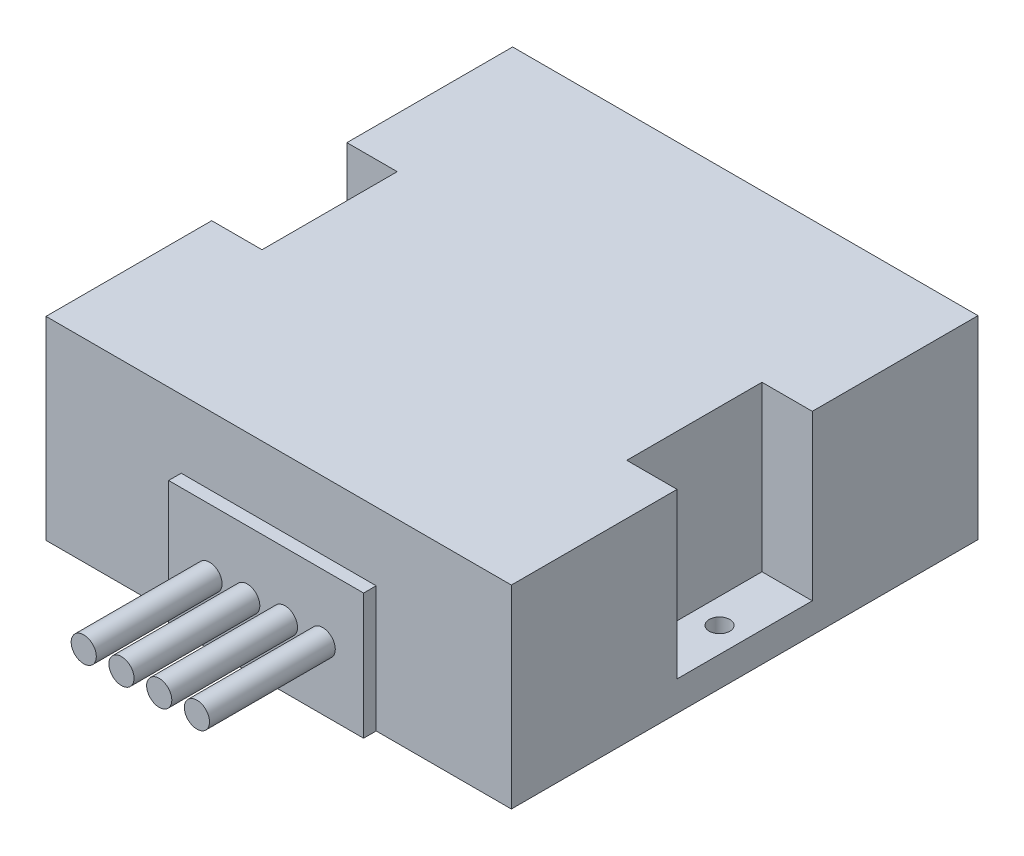
ISO-10303-21;
HEADER;
FILE_DESCRIPTION(('STEP AP214'),'2;1');
FILE_NAME('part.step','',(''),(''),'','','');
FILE_SCHEMA(('AUTOMOTIVE_DESIGN { 1 0 10303 214 1 1 1 1 }'));
ENDSEC;
DATA;
#1=APPLICATION_CONTEXT('core data for automotive mechanical design processes');
#2=APPLICATION_PROTOCOL_DEFINITION('international standard','automotive_design',2000,#1);
#3=PRODUCT_CONTEXT('',#1,'mechanical');
#4=PRODUCT('Part','Part','',(#3));
#5=PRODUCT_RELATED_PRODUCT_CATEGORY('part','',(#4));
#6=PRODUCT_DEFINITION_FORMATION('','',#4);
#7=PRODUCT_DEFINITION_CONTEXT('part definition',#1,'design');
#8=PRODUCT_DEFINITION('design','',#6,#7);
#9=PRODUCT_DEFINITION_SHAPE('','',#8);
#10=(LENGTH_UNIT() NAMED_UNIT(*) SI_UNIT(.MILLI.,.METRE.));
#11=(NAMED_UNIT(*) PLANE_ANGLE_UNIT() SI_UNIT($,.RADIAN.));
#12=(NAMED_UNIT(*) SI_UNIT($,.STERADIAN.) SOLID_ANGLE_UNIT());
#13=UNCERTAINTY_MEASURE_WITH_UNIT(LENGTH_MEASURE(1.E-05),#10,'distance_accuracy_value','');
#14=(GEOMETRIC_REPRESENTATION_CONTEXT(3) GLOBAL_UNCERTAINTY_ASSIGNED_CONTEXT((#13)) GLOBAL_UNIT_ASSIGNED_CONTEXT((#10,
#11,#12)) REPRESENTATION_CONTEXT('',''));
#15=CARTESIAN_POINT('',(0.,0.,0.));
#16=DIRECTION('',(0.,0.,1.));
#17=DIRECTION('',(1.,0.,0.));
#18=AXIS2_PLACEMENT_3D('',#15,#16,#17);
#19=CARTESIAN_POINT('',(36.9999999999998,15.425,-37.0999999999999));
#20=DIRECTION('',(-1.,0.,0.));
#21=DIRECTION('',(0.,0.,1.));
#22=AXIS2_PLACEMENT_3D('',#19,#20,#21);
#23=PLANE('',#22);
#24=DIRECTION('',(0.,1.,0.));
#25=VECTOR('',#24,1.);
#26=CARTESIAN_POINT('',(37.,-10.675,10.75));
#27=LINE('',#26,#25);
#28=CARTESIAN_POINT('',(37.,-10.675,10.75));
#29=VERTEX_POINT('',#28);
#30=CARTESIAN_POINT('',(37.,15.425,10.75));
#31=VERTEX_POINT('',#30);
#32=EDGE_CURVE('E186',#29,#31,#27,.T.);
#33=ORIENTED_EDGE('',*,*,#32,.T.);
#34=DIRECTION('',(0.,0.,-1.));
#35=VECTOR('',#34,1.);
#36=CARTESIAN_POINT('',(36.9999999999998,15.425,-37.0999999999999));
#37=LINE('',#36,#35);
#38=CARTESIAN_POINT('',(36.9999999999998,15.425,37.1000000000001));
#39=VERTEX_POINT('',#38);
#40=EDGE_CURVE('E255',#39,#31,#37,.T.);
#41=ORIENTED_EDGE('',*,*,#40,.F.);
#42=DIRECTION('',(0.,-1.,0.));
#43=VECTOR('',#42,1.);
#44=CARTESIAN_POINT('',(36.9999999999998,15.425,37.1000000000001));
#45=LINE('',#44,#43);
#46=CARTESIAN_POINT('',(36.9999999999998,-15.425,37.1000000000001));
#47=VERTEX_POINT('',#46);
#48=EDGE_CURVE('E266',#39,#47,#45,.T.);
#49=ORIENTED_EDGE('',*,*,#48,.T.);
#50=DIRECTION('',(0.,0.,-1.));
#51=VECTOR('',#50,1.);
#52=CARTESIAN_POINT('',(36.9999999999998,-15.425,-37.0999999999999));
#53=LINE('',#52,#51);
#54=CARTESIAN_POINT('',(36.9999999999998,-15.425,-37.0999999999999));
#55=VERTEX_POINT('',#54);
#56=EDGE_CURVE('E249',#47,#55,#53,.T.);
#57=ORIENTED_EDGE('',*,*,#56,.T.);
#58=DIRECTION('',(0.,-1.,0.));
#59=VECTOR('',#58,1.);
#60=CARTESIAN_POINT('',(36.9999999999998,15.425,-37.0999999999999));
#61=LINE('',#60,#59);
#62=CARTESIAN_POINT('',(36.9999999999998,15.425,-37.0999999999999));
#63=VERTEX_POINT('',#62);
#64=EDGE_CURVE('E284',#63,#55,#61,.T.);
#65=ORIENTED_EDGE('',*,*,#64,.F.);
#66=CARTESIAN_POINT('',(36.9999999999998,15.425,-10.75));
#67=VERTEX_POINT('',#66);
#68=EDGE_CURVE('E172',#67,#63,#37,.T.);
#69=ORIENTED_EDGE('',*,*,#68,.F.);
#70=DIRECTION('',(0.,1.,0.));
#71=VECTOR('',#70,1.);
#72=CARTESIAN_POINT('',(37.,-10.675,-10.75));
#73=LINE('',#72,#71);
#74=CARTESIAN_POINT('',(37.,-10.675,-10.75));
#75=VERTEX_POINT('',#74);
#76=EDGE_CURVE('E55',#75,#67,#73,.T.);
#77=ORIENTED_EDGE('',*,*,#76,.F.);
#78=DIRECTION('',(0.,0.,1.));
#79=VECTOR('',#78,1.);
#80=CARTESIAN_POINT('',(37.,-10.675,10.75));
#81=LINE('',#80,#79);
#82=EDGE_CURVE('E160',#75,#29,#81,.T.);
#83=ORIENTED_EDGE('',*,*,#82,.T.);
#84=EDGE_LOOP('',(#33,#41,#49,#57,#65,#69,#77,#83));
#85=FACE_BOUND('',#84,.T.);
#86=ADVANCED_FACE('F41',(#85),#23,.F.);
#87=CARTESIAN_POINT('',(0.,15.425,0.));
#88=DIRECTION('',(0.,1.,0.));
#89=DIRECTION('',(0.,0.,1.));
#90=AXIS2_PLACEMENT_3D('',#87,#88,#89);
#91=PLANE('',#90);
#92=ORIENTED_EDGE('',*,*,#40,.T.);
#93=DIRECTION('',(-1.,0.,0.));
#94=VECTOR('',#93,1.);
#95=CARTESIAN_POINT('',(29.,15.425,10.75));
#96=LINE('',#95,#94);
#97=CARTESIAN_POINT('',(29.,15.425,10.75));
#98=VERTEX_POINT('',#97);
#99=EDGE_CURVE('E168',#31,#98,#96,.T.);
#100=ORIENTED_EDGE('',*,*,#99,.T.);
#101=DIRECTION('',(0.,0.,-1.));
#102=VECTOR('',#101,1.);
#103=CARTESIAN_POINT('',(29.,15.425,10.75));
#104=LINE('',#103,#102);
#105=CARTESIAN_POINT('',(29.,15.425,-10.75));
#106=VERTEX_POINT('',#105);
#107=EDGE_CURVE('E342',#98,#106,#104,.T.);
#108=ORIENTED_EDGE('',*,*,#107,.T.);
#109=DIRECTION('',(1.,0.,0.));
#110=VECTOR('',#109,1.);
#111=CARTESIAN_POINT('',(29.,15.425,-10.75));
#112=LINE('',#111,#110);
#113=EDGE_CURVE('E340',#106,#67,#112,.T.);
#114=ORIENTED_EDGE('',*,*,#113,.T.);
#115=ORIENTED_EDGE('',*,*,#68,.T.);
#116=DIRECTION('',(-1.,0.,0.));
#117=VECTOR('',#116,1.);
#118=CARTESIAN_POINT('',(-37.,15.425,-37.0999999999999));
#119=LINE('',#118,#117);
#120=CARTESIAN_POINT('',(-37.,15.425,-37.0999999999999));
#121=VERTEX_POINT('',#120);
#122=EDGE_CURVE('E258',#63,#121,#119,.T.);
#123=ORIENTED_EDGE('',*,*,#122,.T.);
#124=DIRECTION('',(0.,0.,1.));
#125=VECTOR('',#124,1.);
#126=CARTESIAN_POINT('',(-37.,15.425,-37.0999999999999));
#127=LINE('',#126,#125);
#128=CARTESIAN_POINT('',(-37.,15.425,-10.75));
#129=VERTEX_POINT('',#128);
#130=EDGE_CURVE('E261',#121,#129,#127,.T.);
#131=ORIENTED_EDGE('',*,*,#130,.T.);
#132=DIRECTION('',(-1.,0.,0.));
#133=VECTOR('',#132,1.);
#134=CARTESIAN_POINT('',(-29.,15.425,-10.75));
#135=LINE('',#134,#133);
#136=CARTESIAN_POINT('',(-29.,15.425,-10.75));
#137=VERTEX_POINT('',#136);
#138=EDGE_CURVE('E230',#137,#129,#135,.T.);
#139=ORIENTED_EDGE('',*,*,#138,.F.);
#140=DIRECTION('',(0.,0.,-1.));
#141=VECTOR('',#140,1.);
#142=CARTESIAN_POINT('',(-29.,15.425,10.75));
#143=LINE('',#142,#141);
#144=CARTESIAN_POINT('',(-29.,15.425,10.75));
#145=VERTEX_POINT('',#144);
#146=EDGE_CURVE('E242',#145,#137,#143,.T.);
#147=ORIENTED_EDGE('',*,*,#146,.F.);
#148=DIRECTION('',(1.,0.,0.));
#149=VECTOR('',#148,1.);
#150=CARTESIAN_POINT('',(-29.,15.425,10.75));
#151=LINE('',#150,#149);
#152=CARTESIAN_POINT('',(-37.,15.425,10.75));
#153=VERTEX_POINT('',#152);
#154=EDGE_CURVE('E225',#153,#145,#151,.T.);
#155=ORIENTED_EDGE('',*,*,#154,.F.);
#156=CARTESIAN_POINT('',(-37.,15.425,37.1000000000001));
#157=VERTEX_POINT('',#156);
#158=EDGE_CURVE('E260',#153,#157,#127,.T.);
#159=ORIENTED_EDGE('',*,*,#158,.T.);
#160=DIRECTION('',(1.,0.,0.));
#161=VECTOR('',#160,1.);
#162=CARTESIAN_POINT('',(-37.,15.425,37.1000000000001));
#163=LINE('',#162,#161);
#164=EDGE_CURVE('E264',#157,#39,#163,.T.);
#165=ORIENTED_EDGE('',*,*,#164,.T.);
#166=EDGE_LOOP('',(#92,#100,#108,#114,#115,#123,#131,#139,#147,#155,#159,#165));
#167=FACE_BOUND('',#166,.T.);
#168=ADVANCED_FACE('F325',(#167),#91,.T.);
#169=CARTESIAN_POINT('',(-37.,15.425,37.1000000000001));
#170=DIRECTION('',(0.,0.,-1.));
#171=DIRECTION('',(-1.,0.,0.));
#172=AXIS2_PLACEMENT_3D('',#169,#170,#171);
#173=PLANE('',#172);
#174=DIRECTION('',(0.,1.,0.));
#175=VECTOR('',#174,1.);
#176=CARTESIAN_POINT('',(15.5,4.575,37.1000000000001));
#177=LINE('',#176,#175);
#178=CARTESIAN_POINT('',(15.5,-15.425,37.1000000000001));
#179=VERTEX_POINT('',#178);
#180=CARTESIAN_POINT('',(15.5,4.575,37.1000000000001));
#181=VERTEX_POINT('',#180);
#182=EDGE_CURVE('E190',#179,#181,#177,.T.);
#183=ORIENTED_EDGE('',*,*,#182,.F.);
#184=DIRECTION('',(1.,0.,0.));
#185=VECTOR('',#184,1.);
#186=CARTESIAN_POINT('',(-37.,-15.425,37.1000000000001));
#187=LINE('',#186,#185);
#188=EDGE_CURVE('E273',#179,#47,#187,.T.);
#189=ORIENTED_EDGE('',*,*,#188,.T.);
#190=ORIENTED_EDGE('',*,*,#48,.F.);
#191=ORIENTED_EDGE('',*,*,#164,.F.);
#192=DIRECTION('',(0.,-1.,0.));
#193=VECTOR('',#192,1.);
#194=CARTESIAN_POINT('',(-37.,15.425,37.1000000000001));
#195=LINE('',#194,#193);
#196=CARTESIAN_POINT('',(-37.,-15.425,37.1000000000001));
#197=VERTEX_POINT('',#196);
#198=EDGE_CURVE('E278',#157,#197,#195,.T.);
#199=ORIENTED_EDGE('',*,*,#198,.T.);
#200=CARTESIAN_POINT('',(-15.5,-15.425,37.1000000000001));
#201=VERTEX_POINT('',#200);
#202=EDGE_CURVE('E274',#197,#201,#187,.T.);
#203=ORIENTED_EDGE('',*,*,#202,.T.);
#204=DIRECTION('',(0.,-1.,0.));
#205=VECTOR('',#204,1.);
#206=CARTESIAN_POINT('',(-15.5,4.575,37.1000000000001));
#207=LINE('',#206,#205);
#208=CARTESIAN_POINT('',(-15.5,4.575,37.1000000000001));
#209=VERTEX_POINT('',#208);
#210=EDGE_CURVE('E197',#209,#201,#207,.T.);
#211=ORIENTED_EDGE('',*,*,#210,.F.);
#212=DIRECTION('',(-1.,0.,0.));
#213=VECTOR('',#212,1.);
#214=CARTESIAN_POINT('',(-15.5,4.575,37.1000000000001));
#215=LINE('',#214,#213);
#216=EDGE_CURVE('E63',#181,#209,#215,.T.);
#217=ORIENTED_EDGE('',*,*,#216,.F.);
#218=EDGE_LOOP('',(#183,#189,#190,#191,#199,#203,#211,#217));
#219=FACE_BOUND('',#218,.T.);
#220=ADVANCED_FACE('F320',(#219),#173,.F.);
#221=CARTESIAN_POINT('',(-37.,15.425,-37.0999999999999));
#222=DIRECTION('',(0.,0.,1.));
#223=DIRECTION('',(1.,0.,0.));
#224=AXIS2_PLACEMENT_3D('',#221,#222,#223);
#225=PLANE('',#224);
#226=DIRECTION('',(-1.,0.,0.));
#227=VECTOR('',#226,1.);
#228=CARTESIAN_POINT('',(-37.,-15.425,-37.0999999999999));
#229=LINE('',#228,#227);
#230=CARTESIAN_POINT('',(-37.,-15.425,-37.0999999999999));
#231=VERTEX_POINT('',#230);
#232=EDGE_CURVE('E269',#55,#231,#229,.T.);
#233=ORIENTED_EDGE('',*,*,#232,.T.);
#234=DIRECTION('',(0.,-1.,0.));
#235=VECTOR('',#234,1.);
#236=CARTESIAN_POINT('',(-37.,15.425,-37.0999999999999));
#237=LINE('',#236,#235);
#238=EDGE_CURVE('E281',#121,#231,#237,.T.);
#239=ORIENTED_EDGE('',*,*,#238,.F.);
#240=ORIENTED_EDGE('',*,*,#122,.F.);
#241=ORIENTED_EDGE('',*,*,#64,.T.);
#242=EDGE_LOOP('',(#233,#239,#240,#241));
#243=FACE_BOUND('',#242,.T.);
#244=ADVANCED_FACE('F338',(#243),#225,.F.);
#245=CARTESIAN_POINT('',(-37.,15.425,-37.0999999999999));
#246=DIRECTION('',(1.,0.,0.));
#247=DIRECTION('',(0.,0.,-1.));
#248=AXIS2_PLACEMENT_3D('',#245,#246,#247);
#249=PLANE('',#248);
#250=DIRECTION('',(0.,0.,1.));
#251=VECTOR('',#250,1.);
#252=CARTESIAN_POINT('',(-37.,-10.675,10.75));
#253=LINE('',#252,#251);
#254=CARTESIAN_POINT('',(-37.,-10.675,-10.75));
#255=VERTEX_POINT('',#254);
#256=CARTESIAN_POINT('',(-37.,-10.675,10.75));
#257=VERTEX_POINT('',#256);
#258=EDGE_CURVE('E226',#255,#257,#253,.T.);
#259=ORIENTED_EDGE('',*,*,#258,.F.);
#260=DIRECTION('',(0.,1.,0.));
#261=VECTOR('',#260,1.);
#262=CARTESIAN_POINT('',(-37.,-10.675,-10.75));
#263=LINE('',#262,#261);
#264=EDGE_CURVE('E246',#255,#129,#263,.T.);
#265=ORIENTED_EDGE('',*,*,#264,.T.);
#266=ORIENTED_EDGE('',*,*,#130,.F.);
#267=ORIENTED_EDGE('',*,*,#238,.T.);
#268=DIRECTION('',(0.,0.,1.));
#269=VECTOR('',#268,1.);
#270=CARTESIAN_POINT('',(-37.,-15.425,-37.0999999999999));
#271=LINE('',#270,#269);
#272=EDGE_CURVE('E271',#231,#197,#271,.T.);
#273=ORIENTED_EDGE('',*,*,#272,.T.);
#274=ORIENTED_EDGE('',*,*,#198,.F.);
#275=ORIENTED_EDGE('',*,*,#158,.F.);
#276=DIRECTION('',(0.,1.,0.));
#277=VECTOR('',#276,1.);
#278=CARTESIAN_POINT('',(-37.,-10.675,10.75));
#279=LINE('',#278,#277);
#280=EDGE_CURVE('E239',#257,#153,#279,.T.);
#281=ORIENTED_EDGE('',*,*,#280,.F.);
#282=EDGE_LOOP('',(#259,#265,#266,#267,#273,#274,#275,#281));
#283=FACE_BOUND('',#282,.T.);
#284=ADVANCED_FACE('F333',(#283),#249,.F.);
#285=CARTESIAN_POINT('',(0.,-15.425,0.));
#286=DIRECTION('',(0.,1.,0.));
#287=DIRECTION('',(0.,0.,1.));
#288=AXIS2_PLACEMENT_3D('',#285,#286,#287);
#289=PLANE('',#288);
#290=CARTESIAN_POINT('',(33.,-15.425,0.));
#291=DIRECTION('',(0.,1.,0.));
#292=DIRECTION('',(0.,0.,1.));
#293=AXIS2_PLACEMENT_3D('',#290,#291,#292);
#294=CIRCLE('',#293,1.63195);
#295=CARTESIAN_POINT('',(33.,-15.425,1.63195));
#296=VERTEX_POINT('',#295);
#297=EDGE_CURVE('E343',#296,#296,#294,.T.);
#298=ORIENTED_EDGE('',*,*,#297,.T.);
#299=EDGE_LOOP('',(#298));
#300=FACE_BOUND('',#299,.T.);
#301=CARTESIAN_POINT('',(-33.,-15.425,0.));
#302=DIRECTION('',(0.,1.,0.));
#303=DIRECTION('',(0.,0.,1.));
#304=AXIS2_PLACEMENT_3D('',#301,#302,#303);
#305=CIRCLE('',#304,1.63195);
#306=CARTESIAN_POINT('',(-33.,-15.425,1.63195));
#307=VERTEX_POINT('',#306);
#308=EDGE_CURVE('E222',#307,#307,#305,.T.);
#309=ORIENTED_EDGE('',*,*,#308,.T.);
#310=EDGE_LOOP('',(#309));
#311=FACE_BOUND('',#310,.T.);
#312=ORIENTED_EDGE('',*,*,#56,.F.);
#313=ORIENTED_EDGE('',*,*,#188,.F.);
#314=DIRECTION('',(0.,0.,-1.));
#315=VECTOR('',#314,1.);
#316=CARTESIAN_POINT('',(15.5,-15.425,39.1000000000001));
#317=LINE('',#316,#315);
#318=CARTESIAN_POINT('',(15.5,-15.425,39.1000000000001));
#319=VERTEX_POINT('',#318);
#320=EDGE_CURVE('E203',#319,#179,#317,.T.);
#321=ORIENTED_EDGE('',*,*,#320,.F.);
#322=DIRECTION('',(1.,0.,0.));
#323=VECTOR('',#322,1.);
#324=CARTESIAN_POINT('',(-15.5,-15.425,39.1000000000001));
#325=LINE('',#324,#323);
#326=CARTESIAN_POINT('',(-15.5,-15.425,39.1000000000001));
#327=VERTEX_POINT('',#326);
#328=EDGE_CURVE('E201',#327,#319,#325,.T.);
#329=ORIENTED_EDGE('',*,*,#328,.F.);
#330=DIRECTION('',(0.,0.,-1.));
#331=VECTOR('',#330,1.);
#332=CARTESIAN_POINT('',(-15.5,-15.425,39.1000000000001));
#333=LINE('',#332,#331);
#334=EDGE_CURVE('E211',#327,#201,#333,.T.);
#335=ORIENTED_EDGE('',*,*,#334,.T.);
#336=ORIENTED_EDGE('',*,*,#202,.F.);
#337=ORIENTED_EDGE('',*,*,#272,.F.);
#338=ORIENTED_EDGE('',*,*,#232,.F.);
#339=EDGE_LOOP('',(#312,#313,#321,#329,#335,#336,#337,#338));
#340=FACE_BOUND('',#339,.T.);
#341=ADVANCED_FACE('F317',(#300,#311,#340),#289,.F.);
#342=CARTESIAN_POINT('',(-29.,-10.675,-10.75));
#343=DIRECTION('',(0.,0.,-1.));
#344=DIRECTION('',(-1.,0.,0.));
#345=AXIS2_PLACEMENT_3D('',#342,#343,#344);
#346=PLANE('',#345);
#347=ORIENTED_EDGE('',*,*,#138,.T.);
#348=ORIENTED_EDGE('',*,*,#264,.F.);
#349=DIRECTION('',(-1.,0.,0.));
#350=VECTOR('',#349,1.);
#351=CARTESIAN_POINT('',(-29.,-10.675,-10.75));
#352=LINE('',#351,#350);
#353=CARTESIAN_POINT('',(-29.,-10.675,-10.75));
#354=VERTEX_POINT('',#353);
#355=EDGE_CURVE('E236',#354,#255,#352,.T.);
#356=ORIENTED_EDGE('',*,*,#355,.F.);
#357=DIRECTION('',(0.,1.,0.));
#358=VECTOR('',#357,1.);
#359=CARTESIAN_POINT('',(-29.,-10.675,-10.75));
#360=LINE('',#359,#358);
#361=EDGE_CURVE('E250',#354,#137,#360,.T.);
#362=ORIENTED_EDGE('',*,*,#361,.T.);
#363=EDGE_LOOP('',(#347,#348,#356,#362));
#364=FACE_BOUND('',#363,.T.);
#365=ADVANCED_FACE('F393',(#364),#346,.F.);
#366=CARTESIAN_POINT('',(-29.,-10.675,10.75));
#367=DIRECTION('',(1.,0.,0.));
#368=DIRECTION('',(0.,0.,-1.));
#369=AXIS2_PLACEMENT_3D('',#366,#367,#368);
#370=PLANE('',#369);
#371=ORIENTED_EDGE('',*,*,#146,.T.);
#372=ORIENTED_EDGE('',*,*,#361,.F.);
#373=DIRECTION('',(0.,0.,-1.));
#374=VECTOR('',#373,1.);
#375=CARTESIAN_POINT('',(-29.,-10.675,10.75));
#376=LINE('',#375,#374);
#377=CARTESIAN_POINT('',(-29.,-10.675,10.75));
#378=VERTEX_POINT('',#377);
#379=EDGE_CURVE('E233',#378,#354,#376,.T.);
#380=ORIENTED_EDGE('',*,*,#379,.F.);
#381=DIRECTION('',(0.,1.,0.));
#382=VECTOR('',#381,1.);
#383=CARTESIAN_POINT('',(-29.,-10.675,10.75));
#384=LINE('',#383,#382);
#385=EDGE_CURVE('E252',#378,#145,#384,.T.);
#386=ORIENTED_EDGE('',*,*,#385,.T.);
#387=EDGE_LOOP('',(#371,#372,#380,#386));
#388=FACE_BOUND('',#387,.T.);
#389=ADVANCED_FACE('F411',(#388),#370,.F.);
#390=CARTESIAN_POINT('',(-29.,-10.675,10.75));
#391=DIRECTION('',(0.,0.,1.));
#392=DIRECTION('',(1.,0.,0.));
#393=AXIS2_PLACEMENT_3D('',#390,#391,#392);
#394=PLANE('',#393);
#395=ORIENTED_EDGE('',*,*,#154,.T.);
#396=ORIENTED_EDGE('',*,*,#385,.F.);
#397=DIRECTION('',(1.,0.,0.));
#398=VECTOR('',#397,1.);
#399=CARTESIAN_POINT('',(-29.,-10.675,10.75));
#400=LINE('',#399,#398);
#401=EDGE_CURVE('E229',#257,#378,#400,.T.);
#402=ORIENTED_EDGE('',*,*,#401,.F.);
#403=ORIENTED_EDGE('',*,*,#280,.T.);
#404=EDGE_LOOP('',(#395,#396,#402,#403));
#405=FACE_BOUND('',#404,.T.);
#406=ADVANCED_FACE('F391',(#405),#394,.F.);
#407=CARTESIAN_POINT('',(0.,-10.675,0.));
#408=DIRECTION('',(0.,1.,0.));
#409=DIRECTION('',(0.,0.,1.));
#410=AXIS2_PLACEMENT_3D('',#407,#408,#409);
#411=PLANE('',#410);
#412=CARTESIAN_POINT('',(-33.,-10.675,0.));
#413=DIRECTION('',(0.,1.,0.));
#414=DIRECTION('',(0.,0.,1.));
#415=AXIS2_PLACEMENT_3D('',#412,#413,#414);
#416=CIRCLE('',#415,1.63194999999999);
#417=CARTESIAN_POINT('',(-33.,-10.675,1.63194999999999));
#418=VERTEX_POINT('',#417);
#419=EDGE_CURVE('E219',#418,#418,#416,.T.);
#420=ORIENTED_EDGE('',*,*,#419,.F.);
#421=EDGE_LOOP('',(#420));
#422=FACE_BOUND('',#421,.T.);
#423=ORIENTED_EDGE('',*,*,#258,.T.);
#424=ORIENTED_EDGE('',*,*,#401,.T.);
#425=ORIENTED_EDGE('',*,*,#379,.T.);
#426=ORIENTED_EDGE('',*,*,#355,.T.);
#427=EDGE_LOOP('',(#423,#424,#425,#426));
#428=FACE_BOUND('',#427,.T.);
#429=ADVANCED_FACE('F425',(#422,#428),#411,.T.);
#430=CARTESIAN_POINT('',(-33.,-10.675,0.));
#431=DIRECTION('',(0.,1.,0.));
#432=DIRECTION('',(0.,0.,1.));
#433=AXIS2_PLACEMENT_3D('',#430,#431,#432);
#434=CYLINDRICAL_SURFACE('',#433,1.63194999999999);
#435=ORIENTED_EDGE('',*,*,#308,.F.);
#436=EDGE_LOOP('',(#435));
#437=FACE_BOUND('',#436,.T.);
#438=ORIENTED_EDGE('',*,*,#419,.T.);
#439=EDGE_LOOP('',(#438));
#440=FACE_BOUND('',#439,.T.);
#441=ADVANCED_FACE('F432',(#437,#440),#434,.F.);
#442=CARTESIAN_POINT('',(15.5,4.575,39.1000000000001));
#443=DIRECTION('',(-1.,0.,0.));
#444=DIRECTION('',(0.,0.,1.));
#445=AXIS2_PLACEMENT_3D('',#442,#443,#444);
#446=PLANE('',#445);
#447=ORIENTED_EDGE('',*,*,#182,.T.);
#448=DIRECTION('',(0.,0.,-1.));
#449=VECTOR('',#448,1.);
#450=CARTESIAN_POINT('',(15.5,4.575,39.1000000000001));
#451=LINE('',#450,#449);
#452=CARTESIAN_POINT('',(15.5,4.575,39.1000000000001));
#453=VERTEX_POINT('',#452);
#454=EDGE_CURVE('E217',#453,#181,#451,.T.);
#455=ORIENTED_EDGE('',*,*,#454,.F.);
#456=DIRECTION('',(0.,1.,0.));
#457=VECTOR('',#456,1.);
#458=CARTESIAN_POINT('',(15.5,4.575,39.1000000000001));
#459=LINE('',#458,#457);
#460=EDGE_CURVE('E193',#319,#453,#459,.T.);
#461=ORIENTED_EDGE('',*,*,#460,.F.);
#462=ORIENTED_EDGE('',*,*,#320,.T.);
#463=EDGE_LOOP('',(#447,#455,#461,#462));
#464=FACE_BOUND('',#463,.T.);
#465=ADVANCED_FACE('F308',(#464),#446,.F.);
#466=CARTESIAN_POINT('',(-15.5,4.575,39.1000000000001));
#467=DIRECTION('',(0.,-1.,0.));
#468=DIRECTION('',(0.,0.,-1.));
#469=AXIS2_PLACEMENT_3D('',#466,#467,#468);
#470=PLANE('',#469);
#471=ORIENTED_EDGE('',*,*,#216,.T.);
#472=DIRECTION('',(0.,0.,-1.));
#473=VECTOR('',#472,1.);
#474=CARTESIAN_POINT('',(-15.5,4.575,39.1000000000001));
#475=LINE('',#474,#473);
#476=CARTESIAN_POINT('',(-15.5,4.575,39.1000000000001));
#477=VERTEX_POINT('',#476);
#478=EDGE_CURVE('E214',#477,#209,#475,.T.);
#479=ORIENTED_EDGE('',*,*,#478,.F.);
#480=DIRECTION('',(-1.,0.,0.));
#481=VECTOR('',#480,1.);
#482=CARTESIAN_POINT('',(-15.5,4.575,39.1000000000001));
#483=LINE('',#482,#481);
#484=EDGE_CURVE('E196',#453,#477,#483,.T.);
#485=ORIENTED_EDGE('',*,*,#484,.F.);
#486=ORIENTED_EDGE('',*,*,#454,.T.);
#487=EDGE_LOOP('',(#471,#479,#485,#486));
#488=FACE_BOUND('',#487,.T.);
#489=ADVANCED_FACE('F310',(#488),#470,.F.);
#490=CARTESIAN_POINT('',(-15.5,4.575,39.1000000000001));
#491=DIRECTION('',(1.,0.,0.));
#492=DIRECTION('',(0.,1.,0.));
#493=AXIS2_PLACEMENT_3D('',#490,#491,#492);
#494=PLANE('',#493);
#495=ORIENTED_EDGE('',*,*,#210,.T.);
#496=ORIENTED_EDGE('',*,*,#334,.F.);
#497=DIRECTION('',(0.,-1.,0.));
#498=VECTOR('',#497,1.);
#499=CARTESIAN_POINT('',(-15.5,4.575,39.1000000000001));
#500=LINE('',#499,#498);
#501=EDGE_CURVE('E199',#477,#327,#500,.T.);
#502=ORIENTED_EDGE('',*,*,#501,.F.);
#503=ORIENTED_EDGE('',*,*,#478,.T.);
#504=EDGE_LOOP('',(#495,#496,#502,#503));
#505=FACE_BOUND('',#504,.T.);
#506=ADVANCED_FACE('F295',(#505),#494,.F.);
#507=CARTESIAN_POINT('',(0.,0.,39.1000000000001));
#508=DIRECTION('',(0.,0.,1.));
#509=DIRECTION('',(1.,0.,0.));
#510=AXIS2_PLACEMENT_3D('',#507,#508,#509);
#511=PLANE('',#510);
#512=CARTESIAN_POINT('',(3.,-5.425,39.1000000000001));
#513=DIRECTION('',(0.,0.,1.));
#514=DIRECTION('',(1.,0.,0.));
#515=AXIS2_PLACEMENT_3D('',#512,#513,#514);
#516=CIRCLE('',#515,2.);
#517=CARTESIAN_POINT('',(5.,-5.425,39.1000000000001));
#518=VERTEX_POINT('',#517);
#519=EDGE_CURVE('E11',#518,#518,#516,.T.);
#520=ORIENTED_EDGE('',*,*,#519,.F.);
#521=EDGE_LOOP('',(#520));
#522=FACE_BOUND('',#521,.T.);
#523=CARTESIAN_POINT('',(9.,-5.425,39.1000000000001));
#524=DIRECTION('',(0.,0.,1.));
#525=DIRECTION('',(1.,0.,0.));
#526=AXIS2_PLACEMENT_3D('',#523,#524,#525);
#527=CIRCLE('',#526,2.);
#528=CARTESIAN_POINT('',(11.,-5.425,39.1000000000001));
#529=VERTEX_POINT('',#528);
#530=EDGE_CURVE('E48',#529,#529,#527,.T.);
#531=ORIENTED_EDGE('',*,*,#530,.F.);
#532=EDGE_LOOP('',(#531));
#533=FACE_BOUND('',#532,.T.);
#534=CARTESIAN_POINT('',(-3.,-5.425,39.1000000000001));
#535=DIRECTION('',(0.,0.,1.));
#536=DIRECTION('',(1.,0.,0.));
#537=AXIS2_PLACEMENT_3D('',#534,#535,#536);
#538=CIRCLE('',#537,2.);
#539=CARTESIAN_POINT('',(-1.,-5.425,39.1000000000001));
#540=VERTEX_POINT('',#539);
#541=EDGE_CURVE('E183',#540,#540,#538,.T.);
#542=ORIENTED_EDGE('',*,*,#541,.F.);
#543=EDGE_LOOP('',(#542));
#544=FACE_BOUND('',#543,.T.);
#545=CARTESIAN_POINT('',(-9.,-5.425,39.1000000000001));
#546=DIRECTION('',(0.,0.,1.));
#547=DIRECTION('',(1.,0.,0.));
#548=AXIS2_PLACEMENT_3D('',#545,#546,#547);
#549=CIRCLE('',#548,2.);
#550=CARTESIAN_POINT('',(-7.,-5.425,39.1000000000001));
#551=VERTEX_POINT('',#550);
#552=EDGE_CURVE('E182',#551,#551,#549,.T.);
#553=ORIENTED_EDGE('',*,*,#552,.F.);
#554=EDGE_LOOP('',(#553));
#555=FACE_BOUND('',#554,.T.);
#556=ORIENTED_EDGE('',*,*,#460,.T.);
#557=ORIENTED_EDGE('',*,*,#484,.T.);
#558=ORIENTED_EDGE('',*,*,#501,.T.);
#559=ORIENTED_EDGE('',*,*,#328,.T.);
#560=EDGE_LOOP('',(#556,#557,#558,#559));
#561=FACE_BOUND('',#560,.T.);
#562=ADVANCED_FACE('F291',(#522,#533,#544,#555,#561),#511,.T.);
#563=CARTESIAN_POINT('',(-9.,-5.425,59.1000000000001));
#564=DIRECTION('',(0.,0.,-1.));
#565=DIRECTION('',(-1.,0.,0.));
#566=AXIS2_PLACEMENT_3D('',#563,#564,#565);
#567=CYLINDRICAL_SURFACE('',#566,2.);
#568=CARTESIAN_POINT('',(-9.,-5.425,59.1000000000001));
#569=DIRECTION('',(0.,0.,1.));
#570=DIRECTION('',(1.,0.,0.));
#571=AXIS2_PLACEMENT_3D('',#568,#569,#570);
#572=CIRCLE('',#571,2.);
#573=CARTESIAN_POINT('',(-7.,-5.425,59.1000000000001));
#574=VERTEX_POINT('',#573);
#575=EDGE_CURVE('E187',#574,#574,#572,.T.);
#576=ORIENTED_EDGE('',*,*,#575,.F.);
#577=EDGE_LOOP('',(#576));
#578=FACE_BOUND('',#577,.T.);
#579=ORIENTED_EDGE('',*,*,#552,.T.);
#580=EDGE_LOOP('',(#579));
#581=FACE_BOUND('',#580,.T.);
#582=ADVANCED_FACE('F294',(#578,#581),#567,.T.);
#583=CARTESIAN_POINT('',(-9.,-5.425,59.1000000000001));
#584=DIRECTION('',(0.,0.,1.));
#585=DIRECTION('',(1.,0.,0.));
#586=AXIS2_PLACEMENT_3D('',#583,#584,#585);
#587=PLANE('',#586);
#588=ORIENTED_EDGE('',*,*,#575,.T.);
#589=EDGE_LOOP('',(#588));
#590=FACE_BOUND('',#589,.T.);
#591=ADVANCED_FACE('F471',(#590),#587,.T.);
#592=CARTESIAN_POINT('',(-3.,-5.425,59.1000000000001));
#593=DIRECTION('',(0.,0.,-1.));
#594=DIRECTION('',(-1.,0.,0.));
#595=AXIS2_PLACEMENT_3D('',#592,#593,#594);
#596=CYLINDRICAL_SURFACE('',#595,2.);
#597=CARTESIAN_POINT('',(-3.,-5.425,59.1000000000001));
#598=DIRECTION('',(0.,0.,1.));
#599=DIRECTION('',(1.,0.,0.));
#600=AXIS2_PLACEMENT_3D('',#597,#598,#599);
#601=CIRCLE('',#600,2.);
#602=CARTESIAN_POINT('',(-1.,-5.425,59.1000000000001));
#603=VERTEX_POINT('',#602);
#604=EDGE_CURVE('E179',#603,#603,#601,.T.);
#605=ORIENTED_EDGE('',*,*,#604,.F.);
#606=EDGE_LOOP('',(#605));
#607=FACE_BOUND('',#606,.T.);
#608=ORIENTED_EDGE('',*,*,#541,.T.);
#609=EDGE_LOOP('',(#608));
#610=FACE_BOUND('',#609,.T.);
#611=ADVANCED_FACE('F479',(#607,#610),#596,.T.);
#612=CARTESIAN_POINT('',(-3.,-5.425,59.1000000000001));
#613=DIRECTION('',(0.,0.,1.));
#614=DIRECTION('',(1.,0.,0.));
#615=AXIS2_PLACEMENT_3D('',#612,#613,#614);
#616=PLANE('',#615);
#617=ORIENTED_EDGE('',*,*,#604,.T.);
#618=EDGE_LOOP('',(#617));
#619=FACE_BOUND('',#618,.T.);
#620=ADVANCED_FACE('F486',(#619),#616,.T.);
#621=CARTESIAN_POINT('',(29.,-10.675,10.75));
#622=DIRECTION('',(0.,0.,-1.));
#623=DIRECTION('',(-1.,0.,0.));
#624=AXIS2_PLACEMENT_3D('',#621,#622,#623);
#625=PLANE('',#624);
#626=ORIENTED_EDGE('',*,*,#99,.F.);
#627=ORIENTED_EDGE('',*,*,#32,.F.);
#628=DIRECTION('',(-1.,0.,0.));
#629=VECTOR('',#628,1.);
#630=CARTESIAN_POINT('',(29.,-10.675,10.75));
#631=LINE('',#630,#629);
#632=CARTESIAN_POINT('',(29.,-10.675,10.75));
#633=VERTEX_POINT('',#632);
#634=EDGE_CURVE('E164',#29,#633,#631,.T.);
#635=ORIENTED_EDGE('',*,*,#634,.T.);
#636=DIRECTION('',(0.,1.,0.));
#637=VECTOR('',#636,1.);
#638=CARTESIAN_POINT('',(29.,-10.675,10.75));
#639=LINE('',#638,#637);
#640=EDGE_CURVE('E174',#633,#98,#639,.T.);
#641=ORIENTED_EDGE('',*,*,#640,.T.);
#642=EDGE_LOOP('',(#626,#627,#635,#641));
#643=FACE_BOUND('',#642,.T.);
#644=ADVANCED_FACE('F354',(#643),#625,.T.);
#645=CARTESIAN_POINT('',(29.,-10.675,10.75));
#646=DIRECTION('',(1.,0.,0.));
#647=DIRECTION('',(0.,0.,-1.));
#648=AXIS2_PLACEMENT_3D('',#645,#646,#647);
#649=PLANE('',#648);
#650=ORIENTED_EDGE('',*,*,#107,.F.);
#651=ORIENTED_EDGE('',*,*,#640,.F.);
#652=DIRECTION('',(0.,0.,-1.));
#653=VECTOR('',#652,1.);
#654=CARTESIAN_POINT('',(29.,-10.675,10.75));
#655=LINE('',#654,#653);
#656=CARTESIAN_POINT('',(29.,-10.675,-10.75));
#657=VERTEX_POINT('',#656);
#658=EDGE_CURVE('E159',#633,#657,#655,.T.);
#659=ORIENTED_EDGE('',*,*,#658,.T.);
#660=DIRECTION('',(0.,1.,0.));
#661=VECTOR('',#660,1.);
#662=CARTESIAN_POINT('',(29.,-10.675,-10.75));
#663=LINE('',#662,#661);
#664=EDGE_CURVE('E156',#657,#106,#663,.T.);
#665=ORIENTED_EDGE('',*,*,#664,.T.);
#666=EDGE_LOOP('',(#650,#651,#659,#665));
#667=FACE_BOUND('',#666,.T.);
#668=ADVANCED_FACE('F356',(#667),#649,.T.);
#669=CARTESIAN_POINT('',(29.,-10.675,-10.75));
#670=DIRECTION('',(0.,0.,1.));
#671=DIRECTION('',(1.,0.,0.));
#672=AXIS2_PLACEMENT_3D('',#669,#670,#671);
#673=PLANE('',#672);
#674=ORIENTED_EDGE('',*,*,#113,.F.);
#675=ORIENTED_EDGE('',*,*,#664,.F.);
#676=DIRECTION('',(1.,0.,0.));
#677=VECTOR('',#676,1.);
#678=CARTESIAN_POINT('',(29.,-10.675,-10.75));
#679=LINE('',#678,#677);
#680=EDGE_CURVE('E153',#657,#75,#679,.T.);
#681=ORIENTED_EDGE('',*,*,#680,.T.);
#682=ORIENTED_EDGE('',*,*,#76,.T.);
#683=EDGE_LOOP('',(#674,#675,#681,#682));
#684=FACE_BOUND('',#683,.T.);
#685=ADVANCED_FACE('F155',(#684),#673,.T.);
#686=CARTESIAN_POINT('',(0.,-10.675,0.));
#687=DIRECTION('',(0.,1.,0.));
#688=DIRECTION('',(0.,0.,1.));
#689=AXIS2_PLACEMENT_3D('',#686,#687,#688);
#690=PLANE('',#689);
#691=CARTESIAN_POINT('',(33.,-10.675,0.));
#692=DIRECTION('',(0.,1.,0.));
#693=DIRECTION('',(0.,0.,1.));
#694=AXIS2_PLACEMENT_3D('',#691,#692,#693);
#695=CIRCLE('',#694,1.63194999999999);
#696=CARTESIAN_POINT('',(33.,-10.675,1.63194999999999));
#697=VERTEX_POINT('',#696);
#698=EDGE_CURVE('E347',#697,#697,#695,.T.);
#699=ORIENTED_EDGE('',*,*,#698,.F.);
#700=EDGE_LOOP('',(#699));
#701=FACE_BOUND('',#700,.T.);
#702=ORIENTED_EDGE('',*,*,#82,.F.);
#703=ORIENTED_EDGE('',*,*,#680,.F.);
#704=ORIENTED_EDGE('',*,*,#658,.F.);
#705=ORIENTED_EDGE('',*,*,#634,.F.);
#706=EDGE_LOOP('',(#702,#703,#704,#705));
#707=FACE_BOUND('',#706,.T.);
#708=ADVANCED_FACE('F163',(#701,#707),#690,.T.);
#709=CARTESIAN_POINT('',(33.,-10.675,0.));
#710=DIRECTION('',(0.,1.,0.));
#711=DIRECTION('',(0.,0.,1.));
#712=AXIS2_PLACEMENT_3D('',#709,#710,#711);
#713=CYLINDRICAL_SURFACE('',#712,1.63194999999999);
#714=ORIENTED_EDGE('',*,*,#297,.F.);
#715=EDGE_LOOP('',(#714));
#716=FACE_BOUND('',#715,.T.);
#717=ORIENTED_EDGE('',*,*,#698,.T.);
#718=EDGE_LOOP('',(#717));
#719=FACE_BOUND('',#718,.T.);
#720=ADVANCED_FACE('F524',(#716,#719),#713,.F.);
#721=CARTESIAN_POINT('',(9.,-5.425,59.1000000000001));
#722=DIRECTION('',(0.,0.,-1.));
#723=DIRECTION('',(-1.,0.,0.));
#724=AXIS2_PLACEMENT_3D('',#721,#722,#723);
#725=CYLINDRICAL_SURFACE('',#724,2.);
#726=CARTESIAN_POINT('',(9.,-5.425,59.1000000000001));
#727=DIRECTION('',(0.,0.,-1.));
#728=DIRECTION('',(-1.,0.,0.));
#729=AXIS2_PLACEMENT_3D('',#726,#727,#728);
#730=CIRCLE('',#729,2.);
#731=CARTESIAN_POINT('',(7.,-5.425,59.1000000000001));
#732=VERTEX_POINT('',#731);
#733=EDGE_CURVE('E360',#732,#732,#730,.T.);
#734=ORIENTED_EDGE('',*,*,#733,.T.);
#735=EDGE_LOOP('',(#734));
#736=FACE_BOUND('',#735,.T.);
#737=ORIENTED_EDGE('',*,*,#530,.T.);
#738=EDGE_LOOP('',(#737));
#739=FACE_BOUND('',#738,.T.);
#740=ADVANCED_FACE('F289',(#736,#739),#725,.T.);
#741=CARTESIAN_POINT('',(9.,-5.425,59.1000000000001));
#742=DIRECTION('',(0.,0.,1.));
#743=DIRECTION('',(-1.,0.,0.));
#744=AXIS2_PLACEMENT_3D('',#741,#742,#743);
#745=PLANE('',#744);
#746=ORIENTED_EDGE('',*,*,#733,.F.);
#747=EDGE_LOOP('',(#746));
#748=FACE_BOUND('',#747,.T.);
#749=ADVANCED_FACE('F376',(#748),#745,.T.);
#750=CARTESIAN_POINT('',(3.,-5.425,59.1000000000001));
#751=DIRECTION('',(0.,0.,-1.));
#752=DIRECTION('',(-1.,0.,0.));
#753=AXIS2_PLACEMENT_3D('',#750,#751,#752);
#754=CYLINDRICAL_SURFACE('',#753,2.);
#755=CARTESIAN_POINT('',(3.,-5.425,59.1000000000001));
#756=DIRECTION('',(0.,0.,-1.));
#757=DIRECTION('',(-1.,0.,0.));
#758=AXIS2_PLACEMENT_3D('',#755,#756,#757);
#759=CIRCLE('',#758,2.);
#760=CARTESIAN_POINT('',(1.,-5.425,59.1000000000001));
#761=VERTEX_POINT('',#760);
#762=EDGE_CURVE('E363',#761,#761,#759,.T.);
#763=ORIENTED_EDGE('',*,*,#762,.T.);
#764=EDGE_LOOP('',(#763));
#765=FACE_BOUND('',#764,.T.);
#766=ORIENTED_EDGE('',*,*,#519,.T.);
#767=EDGE_LOOP('',(#766));
#768=FACE_BOUND('',#767,.T.);
#769=ADVANCED_FACE('F367',(#765,#768),#754,.T.);
#770=CARTESIAN_POINT('',(3.,-5.425,59.1000000000001));
#771=DIRECTION('',(0.,0.,1.));
#772=DIRECTION('',(-1.,0.,0.));
#773=AXIS2_PLACEMENT_3D('',#770,#771,#772);
#774=PLANE('',#773);
#775=ORIENTED_EDGE('',*,*,#762,.F.);
#776=EDGE_LOOP('',(#775));
#777=FACE_BOUND('',#776,.T.);
#778=ADVANCED_FACE('F370',(#777),#774,.T.);
#779=CLOSED_SHELL('',(#86,#168,#220,#244,#284,#341,#365,#389,#406,#429,#441,#465,#489,#506,#562,
#582,#591,#611,#620,#644,#668,#685,#708,#720,#740,#749,#769,#778));
#780=MANIFOLD_SOLID_BREP('B2',#779);
#781=ADVANCED_BREP_SHAPE_REPRESENTATION('',(#18,#780),#14);
#782=SHAPE_DEFINITION_REPRESENTATION(#9,#781);
ENDSEC;
END-ISO-10303-21;
